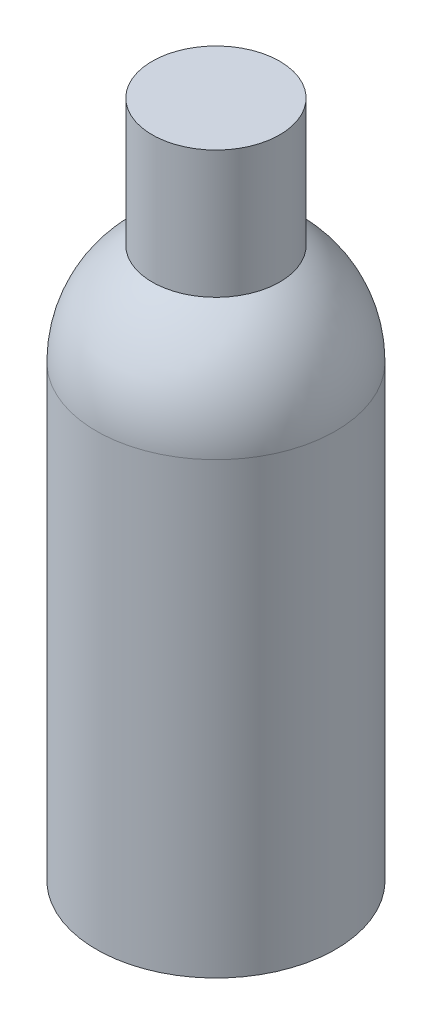
ISO-10303-21;
HEADER;
FILE_DESCRIPTION(('STEP AP214'),'2;1');
FILE_NAME('part.step','',(''),(''),'','','');
FILE_SCHEMA(('AUTOMOTIVE_DESIGN { 1 0 10303 214 1 1 1 1 }'));
ENDSEC;
DATA;
#1=APPLICATION_CONTEXT('core data for automotive mechanical design processes');
#2=APPLICATION_PROTOCOL_DEFINITION('international standard','automotive_design',2000,#1);
#3=PRODUCT_CONTEXT('',#1,'mechanical');
#4=PRODUCT('Part','Part','',(#3));
#5=PRODUCT_RELATED_PRODUCT_CATEGORY('part','',(#4));
#6=PRODUCT_DEFINITION_FORMATION('','',#4);
#7=PRODUCT_DEFINITION_CONTEXT('part definition',#1,'design');
#8=PRODUCT_DEFINITION('design','',#6,#7);
#9=PRODUCT_DEFINITION_SHAPE('','',#8);
#10=(LENGTH_UNIT() NAMED_UNIT(*) SI_UNIT(.MILLI.,.METRE.));
#11=(NAMED_UNIT(*) PLANE_ANGLE_UNIT() SI_UNIT($,.RADIAN.));
#12=(NAMED_UNIT(*) SI_UNIT($,.STERADIAN.) SOLID_ANGLE_UNIT());
#13=UNCERTAINTY_MEASURE_WITH_UNIT(LENGTH_MEASURE(1.E-05),#10,'distance_accuracy_value','');
#14=(GEOMETRIC_REPRESENTATION_CONTEXT(3) GLOBAL_UNCERTAINTY_ASSIGNED_CONTEXT((#13)) GLOBAL_UNIT_ASSIGNED_CONTEXT((#10,
#11,#12)) REPRESENTATION_CONTEXT('',''));
#15=CARTESIAN_POINT('',(0.,0.,0.));
#16=DIRECTION('',(0.,0.,1.));
#17=DIRECTION('',(1.,0.,0.));
#18=AXIS2_PLACEMENT_3D('',#15,#16,#17);
#19=CARTESIAN_POINT('',(0.,0.,0.));
#20=DIRECTION('',(0.,-1.,0.));
#21=DIRECTION('',(0.,0.,-1.));
#22=AXIS2_PLACEMENT_3D('',#19,#20,#21);
#23=PLANE('',#22);
#24=CARTESIAN_POINT('',(0.,0.,0.));
#25=DIRECTION('',(0.,-1.,0.));
#26=DIRECTION('',(0.,0.,-1.));
#27=AXIS2_PLACEMENT_3D('',#24,#25,#26);
#28=CIRCLE('',#27,45.);
#29=CARTESIAN_POINT('',(0.,0.,-45.));
#30=VERTEX_POINT('',#29);
#31=EDGE_CURVE('E10',#30,#30,#28,.T.);
#32=ORIENTED_EDGE('',*,*,#31,.T.);
#33=EDGE_LOOP('',(#32));
#34=FACE_BOUND('',#33,.T.);
#35=ADVANCED_FACE('F43',(#34),#23,.T.);
#36=CARTESIAN_POINT('',(0.,0.,0.));
#37=DIRECTION('',(0.,-1.,0.));
#38=DIRECTION('',(0.,0.,-1.));
#39=AXIS2_PLACEMENT_3D('',#36,#37,#38);
#40=CYLINDRICAL_SURFACE('',#39,45.);
#41=CARTESIAN_POINT('',(0.,168.934267378651,0.));
#42=DIRECTION('',(0.,-1.,0.));
#43=DIRECTION('',(0.,0.,-1.));
#44=AXIS2_PLACEMENT_3D('',#41,#42,#43);
#45=CIRCLE('',#44,45.);
#46=CARTESIAN_POINT('',(0.,168.934267378651,-45.));
#47=VERTEX_POINT('',#46);
#48=EDGE_CURVE('E50',#47,#47,#45,.T.);
#49=ORIENTED_EDGE('',*,*,#48,.T.);
#50=EDGE_LOOP('',(#49));
#51=FACE_BOUND('',#50,.T.);
#52=ORIENTED_EDGE('',*,*,#31,.F.);
#53=EDGE_LOOP('',(#52));
#54=FACE_BOUND('',#53,.T.);
#55=ADVANCED_FACE('F79',(#51,#54),#40,.T.);
#56=CARTESIAN_POINT('',(0.,168.934267378651,0.));
#57=DIRECTION('',(0.,-1.,0.));
#58=DIRECTION('',(1.,0.,0.));
#59=AXIS2_PLACEMENT_3D('',#56,#57,#58);
#60=SPHERICAL_SURFACE('',#59,45.);
#61=CARTESIAN_POINT('',(0.,207.,0.));
#62=DIRECTION('',(0.,-1.,0.));
#63=DIRECTION('',(0.,0.,-1.));
#64=AXIS2_PLACEMENT_3D('',#61,#62,#63);
#65=CIRCLE('',#64,24.);
#66=CARTESIAN_POINT('',(0.,207.,-24.));
#67=VERTEX_POINT('',#66);
#68=EDGE_CURVE('E55',#67,#67,#65,.T.);
#69=ORIENTED_EDGE('',*,*,#68,.T.);
#70=EDGE_LOOP('',(#69));
#71=FACE_BOUND('',#70,.T.);
#72=ORIENTED_EDGE('',*,*,#48,.F.);
#73=EDGE_LOOP('',(#72));
#74=FACE_BOUND('',#73,.T.);
#75=ADVANCED_FACE('F76',(#71,#74),#60,.T.);
#76=CARTESIAN_POINT('',(0.,0.,0.));
#77=DIRECTION('',(0.,-1.,0.));
#78=DIRECTION('',(0.,0.,-1.));
#79=AXIS2_PLACEMENT_3D('',#76,#77,#78);
#80=CYLINDRICAL_SURFACE('',#79,24.);
#81=CARTESIAN_POINT('',(0.,255.,0.));
#82=DIRECTION('',(0.,-1.,0.));
#83=DIRECTION('',(0.,0.,-1.));
#84=AXIS2_PLACEMENT_3D('',#81,#82,#83);
#85=CIRCLE('',#84,24.);
#86=CARTESIAN_POINT('',(0.,255.,-24.));
#87=VERTEX_POINT('',#86);
#88=EDGE_CURVE('E60',#87,#87,#85,.T.);
#89=ORIENTED_EDGE('',*,*,#88,.T.);
#90=EDGE_LOOP('',(#89));
#91=FACE_BOUND('',#90,.T.);
#92=ORIENTED_EDGE('',*,*,#68,.F.);
#93=EDGE_LOOP('',(#92));
#94=FACE_BOUND('',#93,.T.);
#95=ADVANCED_FACE('F67',(#91,#94),#80,.T.);
#96=CARTESIAN_POINT('',(24.,255.,0.));
#97=DIRECTION('',(0.,1.,0.));
#98=DIRECTION('',(0.,0.,1.));
#99=AXIS2_PLACEMENT_3D('',#96,#97,#98);
#100=PLANE('',#99);
#101=ORIENTED_EDGE('',*,*,#88,.F.);
#102=EDGE_LOOP('',(#101));
#103=FACE_BOUND('',#102,.T.);
#104=ADVANCED_FACE('F70',(#103),#100,.T.);
#105=CLOSED_SHELL('',(#35,#55,#75,#95,#104));
#106=MANIFOLD_SOLID_BREP('B2',#105);
#107=ADVANCED_BREP_SHAPE_REPRESENTATION('',(#18,#106),#14);
#108=SHAPE_DEFINITION_REPRESENTATION(#9,#107);
ENDSEC;
END-ISO-10303-21;
